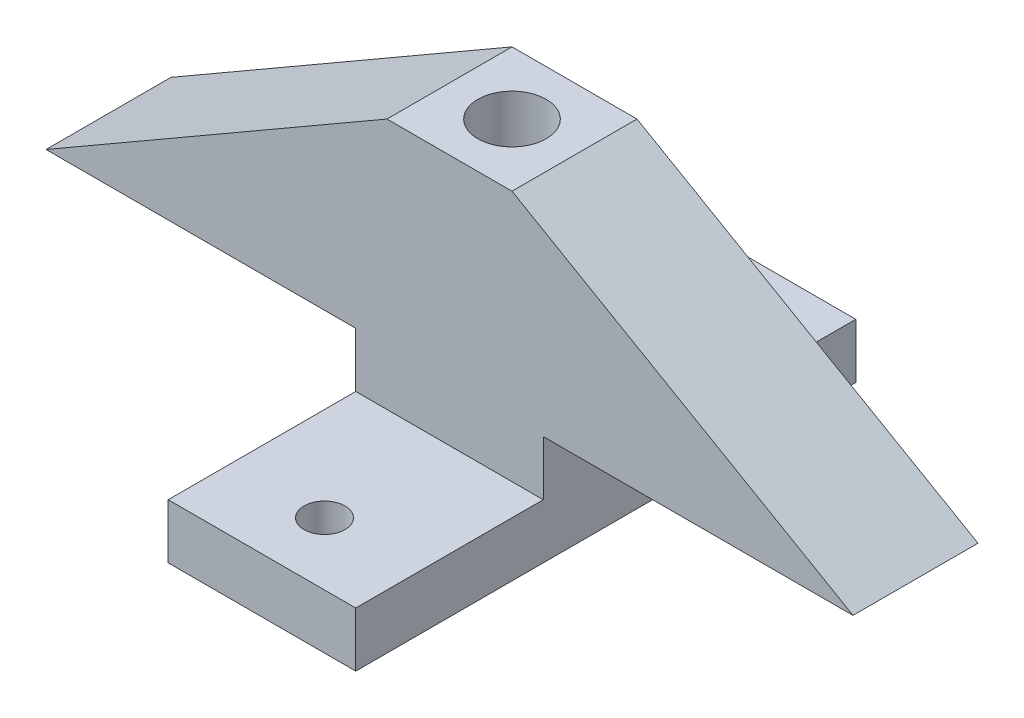
ISO-10303-21;
HEADER;
FILE_DESCRIPTION(('STEP AP214'),'2;1');
FILE_NAME('part.step','',(''),(''),'','','');
FILE_SCHEMA(('AUTOMOTIVE_DESIGN { 1 0 10303 214 1 1 1 1 }'));
ENDSEC;
DATA;
#1=APPLICATION_CONTEXT('core data for automotive mechanical design processes');
#2=APPLICATION_PROTOCOL_DEFINITION('international standard','automotive_design',2000,#1);
#3=PRODUCT_CONTEXT('',#1,'mechanical');
#4=PRODUCT('Part','Part','',(#3));
#5=PRODUCT_RELATED_PRODUCT_CATEGORY('part','',(#4));
#6=PRODUCT_DEFINITION_FORMATION('','',#4);
#7=PRODUCT_DEFINITION_CONTEXT('part definition',#1,'design');
#8=PRODUCT_DEFINITION('design','',#6,#7);
#9=PRODUCT_DEFINITION_SHAPE('','',#8);
#10=(LENGTH_UNIT() NAMED_UNIT(*) SI_UNIT(.MILLI.,.METRE.));
#11=(NAMED_UNIT(*) PLANE_ANGLE_UNIT() SI_UNIT($,.RADIAN.));
#12=(NAMED_UNIT(*) SI_UNIT($,.STERADIAN.) SOLID_ANGLE_UNIT());
#13=UNCERTAINTY_MEASURE_WITH_UNIT(LENGTH_MEASURE(1.E-05),#10,'distance_accuracy_value','');
#14=(GEOMETRIC_REPRESENTATION_CONTEXT(3) GLOBAL_UNCERTAINTY_ASSIGNED_CONTEXT((#13)) GLOBAL_UNIT_ASSIGNED_CONTEXT((#10,
#11,#12)) REPRESENTATION_CONTEXT('',''));
#15=CARTESIAN_POINT('',(0.,0.,0.));
#16=DIRECTION('',(0.,0.,1.));
#17=DIRECTION('',(1.,0.,0.));
#18=AXIS2_PLACEMENT_3D('',#15,#16,#17);
#19=CARTESIAN_POINT('',(0.,0.,25.4));
#20=DIRECTION('',(0.,0.,-1.));
#21=DIRECTION('',(-1.,0.,0.));
#22=AXIS2_PLACEMENT_3D('',#19,#20,#21);
#23=PLANE('',#22);
#24=DIRECTION('',(-1.,0.,0.));
#25=VECTOR('',#24,1.);
#26=CARTESIAN_POINT('',(0.,11.1125,25.4));
#27=LINE('',#26,#25);
#28=CARTESIAN_POINT('',(38.1,11.1125,25.4));
#29=VERTEX_POINT('',#28);
#30=CARTESIAN_POINT('',(0.,11.1125,25.4));
#31=VERTEX_POINT('',#30);
#32=EDGE_CURVE('E57',#29,#31,#27,.T.);
#33=ORIENTED_EDGE('',*,*,#32,.F.);
#34=DIRECTION('',(0.,1.,0.));
#35=VECTOR('',#34,1.);
#36=CARTESIAN_POINT('',(38.1,22.225,25.4));
#37=LINE('',#36,#35);
#38=CARTESIAN_POINT('',(38.1,22.225,25.4));
#39=VERTEX_POINT('',#38);
#40=EDGE_CURVE('E186',#29,#39,#37,.T.);
#41=ORIENTED_EDGE('',*,*,#40,.T.);
#42=DIRECTION('',(1.,0.,0.));
#43=VECTOR('',#42,1.);
#44=CARTESIAN_POINT('',(101.032032302756,22.225,25.4));
#45=LINE('',#44,#43);
#46=CARTESIAN_POINT('',(101.032032302756,22.225,25.4));
#47=VERTEX_POINT('',#46);
#48=EDGE_CURVE('E188',#39,#47,#45,.T.);
#49=ORIENTED_EDGE('',*,*,#48,.T.);
#50=DIRECTION('',(-0.866025403784442,0.499999999999995,0.));
#51=VECTOR('',#50,1.);
#52=CARTESIAN_POINT('',(31.75,62.225,25.4));
#53=LINE('',#52,#51);
#54=CARTESIAN_POINT('',(31.75,62.225,25.4));
#55=VERTEX_POINT('',#54);
#56=EDGE_CURVE('E191',#47,#55,#53,.T.);
#57=ORIENTED_EDGE('',*,*,#56,.T.);
#58=DIRECTION('',(-1.,0.,0.));
#59=VECTOR('',#58,1.);
#60=CARTESIAN_POINT('',(6.35,62.225,25.4));
#61=LINE('',#60,#59);
#62=CARTESIAN_POINT('',(6.35,62.225,25.4));
#63=VERTEX_POINT('',#62);
#64=EDGE_CURVE('E193',#55,#63,#61,.T.);
#65=ORIENTED_EDGE('',*,*,#64,.T.);
#66=DIRECTION('',(-0.866025403784441,-0.499999999999995,0.));
#67=VECTOR('',#66,1.);
#68=CARTESIAN_POINT('',(-62.932032302756,22.225,25.4));
#69=LINE('',#68,#67);
#70=CARTESIAN_POINT('',(-62.932032302756,22.225,25.4));
#71=VERTEX_POINT('',#70);
#72=EDGE_CURVE('E195',#63,#71,#69,.T.);
#73=ORIENTED_EDGE('',*,*,#72,.T.);
#74=DIRECTION('',(1.,0.,0.));
#75=VECTOR('',#74,1.);
#76=CARTESIAN_POINT('',(0.,22.225,25.4));
#77=LINE('',#76,#75);
#78=CARTESIAN_POINT('',(0.,22.225,25.4));
#79=VERTEX_POINT('',#78);
#80=EDGE_CURVE('E197',#71,#79,#77,.T.);
#81=ORIENTED_EDGE('',*,*,#80,.T.);
#82=DIRECTION('',(0.,-1.,0.));
#83=VECTOR('',#82,1.);
#84=CARTESIAN_POINT('',(0.,0.,25.4));
#85=LINE('',#84,#83);
#86=EDGE_CURVE('E199',#79,#31,#85,.T.);
#87=ORIENTED_EDGE('',*,*,#86,.T.);
#88=EDGE_LOOP('',(#33,#41,#49,#57,#65,#73,#81,#87));
#89=FACE_BOUND('',#88,.T.);
#90=ADVANCED_FACE('F34',(#89),#23,.F.);
#91=CARTESIAN_POINT('',(38.1,0.,25.4));
#92=DIRECTION('',(0.,1.,0.));
#93=DIRECTION('',(-1.,0.,0.));
#94=AXIS2_PLACEMENT_3D('',#91,#92,#93);
#95=PLANE('',#94);
#96=CARTESIAN_POINT('',(19.05,0.,-25.4));
#97=DIRECTION('',(0.,1.,0.));
#98=DIRECTION('',(0.,0.,1.));
#99=AXIS2_PLACEMENT_3D('',#96,#97,#98);
#100=CIRCLE('',#99,4.1656);
#101=CARTESIAN_POINT('',(19.05,0.,-21.2344));
#102=VERTEX_POINT('',#101);
#103=EDGE_CURVE('E138',#102,#102,#100,.T.);
#104=ORIENTED_EDGE('',*,*,#103,.T.);
#105=EDGE_LOOP('',(#104));
#106=FACE_BOUND('',#105,.T.);
#107=CARTESIAN_POINT('',(19.05,0.,50.8));
#108=DIRECTION('',(0.,1.,0.));
#109=DIRECTION('',(0.,0.,1.));
#110=AXIS2_PLACEMENT_3D('',#107,#108,#109);
#111=CIRCLE('',#110,4.1656);
#112=CARTESIAN_POINT('',(19.05,0.,54.9656));
#113=VERTEX_POINT('',#112);
#114=EDGE_CURVE('E148',#113,#113,#111,.T.);
#115=ORIENTED_EDGE('',*,*,#114,.T.);
#116=EDGE_LOOP('',(#115));
#117=FACE_BOUND('',#116,.T.);
#118=DIRECTION('',(0.,0.,-1.));
#119=VECTOR('',#118,1.);
#120=CARTESIAN_POINT('',(0.,0.,25.4));
#121=LINE('',#120,#119);
#122=CARTESIAN_POINT('',(0.,0.,63.5));
#123=VERTEX_POINT('',#122);
#124=CARTESIAN_POINT('',(0.,0.,-38.1));
#125=VERTEX_POINT('',#124);
#126=EDGE_CURVE('E201',#123,#125,#121,.T.);
#127=ORIENTED_EDGE('',*,*,#126,.T.);
#128=DIRECTION('',(-1.,0.,0.));
#129=VECTOR('',#128,1.);
#130=CARTESIAN_POINT('',(38.1,0.,-38.1));
#131=LINE('',#130,#129);
#132=CARTESIAN_POINT('',(38.1,0.,-38.1));
#133=VERTEX_POINT('',#132);
#134=EDGE_CURVE('E154',#133,#125,#131,.T.);
#135=ORIENTED_EDGE('',*,*,#134,.F.);
#136=DIRECTION('',(0.,0.,-1.));
#137=VECTOR('',#136,1.);
#138=CARTESIAN_POINT('',(38.1,0.,25.4));
#139=LINE('',#138,#137);
#140=CARTESIAN_POINT('',(38.1,0.,63.5));
#141=VERTEX_POINT('',#140);
#142=EDGE_CURVE('E11',#141,#133,#139,.T.);
#143=ORIENTED_EDGE('',*,*,#142,.F.);
#144=DIRECTION('',(1.,0.,0.));
#145=VECTOR('',#144,1.);
#146=CARTESIAN_POINT('',(0.,0.,63.5));
#147=LINE('',#146,#145);
#148=EDGE_CURVE('E171',#123,#141,#147,.T.);
#149=ORIENTED_EDGE('',*,*,#148,.F.);
#150=EDGE_LOOP('',(#127,#135,#143,#149));
#151=FACE_BOUND('',#150,.T.);
#152=ADVANCED_FACE('F36',(#106,#117,#151),#95,.F.);
#153=CARTESIAN_POINT('',(38.1,22.225,25.4));
#154=DIRECTION('',(-1.,0.,0.));
#155=DIRECTION('',(0.,0.,1.));
#156=AXIS2_PLACEMENT_3D('',#153,#154,#155);
#157=PLANE('',#156);
#158=ORIENTED_EDGE('',*,*,#142,.T.);
#159=DIRECTION('',(0.,-1.,0.));
#160=VECTOR('',#159,1.);
#161=CARTESIAN_POINT('',(38.1,0.,-38.1));
#162=LINE('',#161,#160);
#163=CARTESIAN_POINT('',(38.1,11.1125,-38.1));
#164=VERTEX_POINT('',#163);
#165=EDGE_CURVE('E151',#164,#133,#162,.T.);
#166=ORIENTED_EDGE('',*,*,#165,.F.);
#167=DIRECTION('',(0.,0.,1.));
#168=VECTOR('',#167,1.);
#169=CARTESIAN_POINT('',(38.1,11.1125,-38.1));
#170=LINE('',#169,#168);
#171=CARTESIAN_POINT('',(38.1,11.1125,0.));
#172=VERTEX_POINT('',#171);
#173=EDGE_CURVE('E161',#164,#172,#170,.T.);
#174=ORIENTED_EDGE('',*,*,#173,.T.);
#175=DIRECTION('',(0.,1.,0.));
#176=VECTOR('',#175,1.);
#177=CARTESIAN_POINT('',(38.1,22.225,0.));
#178=LINE('',#177,#176);
#179=CARTESIAN_POINT('',(38.1,22.225,0.));
#180=VERTEX_POINT('',#179);
#181=EDGE_CURVE('E185',#172,#180,#178,.T.);
#182=ORIENTED_EDGE('',*,*,#181,.T.);
#183=DIRECTION('',(0.,0.,-1.));
#184=VECTOR('',#183,1.);
#185=CARTESIAN_POINT('',(38.1,22.225,25.4));
#186=LINE('',#185,#184);
#187=EDGE_CURVE('E42',#39,#180,#186,.T.);
#188=ORIENTED_EDGE('',*,*,#187,.F.);
#189=ORIENTED_EDGE('',*,*,#40,.F.);
#190=DIRECTION('',(0.,0.,-1.));
#191=VECTOR('',#190,1.);
#192=CARTESIAN_POINT('',(38.1,11.1125,63.5));
#193=LINE('',#192,#191);
#194=CARTESIAN_POINT('',(38.1,11.1125,63.5));
#195=VERTEX_POINT('',#194);
#196=EDGE_CURVE('E182',#195,#29,#193,.T.);
#197=ORIENTED_EDGE('',*,*,#196,.F.);
#198=DIRECTION('',(0.,1.,0.));
#199=VECTOR('',#198,1.);
#200=CARTESIAN_POINT('',(38.1,0.,63.5));
#201=LINE('',#200,#199);
#202=EDGE_CURVE('E174',#141,#195,#201,.T.);
#203=ORIENTED_EDGE('',*,*,#202,.F.);
#204=EDGE_LOOP('',(#158,#166,#174,#182,#188,#189,#197,#203));
#205=FACE_BOUND('',#204,.T.);
#206=ADVANCED_FACE('F252',(#205),#157,.F.);
#207=CARTESIAN_POINT('',(101.032032302756,22.225,25.4));
#208=DIRECTION('',(0.,1.,0.));
#209=DIRECTION('',(-1.,0.,0.));
#210=AXIS2_PLACEMENT_3D('',#207,#208,#209);
#211=PLANE('',#210);
#212=DIRECTION('',(1.,0.,0.));
#213=VECTOR('',#212,1.);
#214=CARTESIAN_POINT('',(101.032032302756,22.225,0.));
#215=LINE('',#214,#213);
#216=CARTESIAN_POINT('',(101.032032302756,22.225,0.));
#217=VERTEX_POINT('',#216);
#218=EDGE_CURVE('E203',#180,#217,#215,.T.);
#219=ORIENTED_EDGE('',*,*,#218,.T.);
#220=DIRECTION('',(0.,0.,-1.));
#221=VECTOR('',#220,1.);
#222=CARTESIAN_POINT('',(101.032032302756,22.225,25.4));
#223=LINE('',#222,#221);
#224=EDGE_CURVE('E227',#47,#217,#223,.T.);
#225=ORIENTED_EDGE('',*,*,#224,.F.);
#226=ORIENTED_EDGE('',*,*,#48,.F.);
#227=ORIENTED_EDGE('',*,*,#187,.T.);
#228=EDGE_LOOP('',(#219,#225,#226,#227));
#229=FACE_BOUND('',#228,.T.);
#230=ADVANCED_FACE('F234',(#229),#211,.F.);
#231=CARTESIAN_POINT('',(31.75,62.225,25.4));
#232=DIRECTION('',(-0.499999999999995,-0.866025403784442,0.));
#233=DIRECTION('',(0.866025403784442,-0.499999999999995,0.));
#234=AXIS2_PLACEMENT_3D('',#231,#232,#233);
#235=PLANE('',#234);
#236=DIRECTION('',(-0.866025403784442,0.499999999999995,0.));
#237=VECTOR('',#236,1.);
#238=CARTESIAN_POINT('',(31.75,62.225,0.));
#239=LINE('',#238,#237);
#240=CARTESIAN_POINT('',(31.75,62.225,0.));
#241=VERTEX_POINT('',#240);
#242=EDGE_CURVE('E205',#217,#241,#239,.T.);
#243=ORIENTED_EDGE('',*,*,#242,.T.);
#244=DIRECTION('',(0.,0.,-1.));
#245=VECTOR('',#244,1.);
#246=CARTESIAN_POINT('',(31.75,62.225,25.4));
#247=LINE('',#246,#245);
#248=EDGE_CURVE('E224',#55,#241,#247,.T.);
#249=ORIENTED_EDGE('',*,*,#248,.F.);
#250=ORIENTED_EDGE('',*,*,#56,.F.);
#251=ORIENTED_EDGE('',*,*,#224,.T.);
#252=EDGE_LOOP('',(#243,#249,#250,#251));
#253=FACE_BOUND('',#252,.T.);
#254=ADVANCED_FACE('F243',(#253),#235,.F.);
#255=CARTESIAN_POINT('',(6.35,62.225,25.4));
#256=DIRECTION('',(0.,-1.,0.));
#257=DIRECTION('',(0.,0.,-1.));
#258=AXIS2_PLACEMENT_3D('',#255,#256,#257);
#259=PLANE('',#258);
#260=CARTESIAN_POINT('',(19.05,62.225,12.7));
#261=DIRECTION('',(0.,1.,0.));
#262=DIRECTION('',(0.,0.,1.));
#263=AXIS2_PLACEMENT_3D('',#260,#261,#262);
#264=CIRCLE('',#263,6.94689999999999);
#265=CARTESIAN_POINT('',(19.05,62.225,19.6469));
#266=VERTEX_POINT('',#265);
#267=EDGE_CURVE('E135',#266,#266,#264,.T.);
#268=ORIENTED_EDGE('',*,*,#267,.F.);
#269=EDGE_LOOP('',(#268));
#270=FACE_BOUND('',#269,.T.);
#271=DIRECTION('',(-1.,0.,0.));
#272=VECTOR('',#271,1.);
#273=CARTESIAN_POINT('',(6.35,62.225,0.));
#274=LINE('',#273,#272);
#275=CARTESIAN_POINT('',(6.35,62.225,0.));
#276=VERTEX_POINT('',#275);
#277=EDGE_CURVE('E207',#241,#276,#274,.T.);
#278=ORIENTED_EDGE('',*,*,#277,.T.);
#279=DIRECTION('',(0.,0.,-1.));
#280=VECTOR('',#279,1.);
#281=CARTESIAN_POINT('',(6.35,62.225,25.4));
#282=LINE('',#281,#280);
#283=EDGE_CURVE('E221',#63,#276,#282,.T.);
#284=ORIENTED_EDGE('',*,*,#283,.F.);
#285=ORIENTED_EDGE('',*,*,#64,.F.);
#286=ORIENTED_EDGE('',*,*,#248,.T.);
#287=EDGE_LOOP('',(#278,#284,#285,#286));
#288=FACE_BOUND('',#287,.T.);
#289=ADVANCED_FACE('F247',(#270,#288),#259,.F.);
#290=CARTESIAN_POINT('',(-62.932032302756,22.225,25.4));
#291=DIRECTION('',(0.499999999999995,-0.866025403784441,0.));
#292=DIRECTION('',(0.866025403784441,0.499999999999995,0.));
#293=AXIS2_PLACEMENT_3D('',#290,#291,#292);
#294=PLANE('',#293);
#295=DIRECTION('',(-0.866025403784441,-0.499999999999995,0.));
#296=VECTOR('',#295,1.);
#297=CARTESIAN_POINT('',(-62.932032302756,22.225,0.));
#298=LINE('',#297,#296);
#299=CARTESIAN_POINT('',(-62.932032302756,22.225,0.));
#300=VERTEX_POINT('',#299);
#301=EDGE_CURVE('E209',#276,#300,#298,.T.);
#302=ORIENTED_EDGE('',*,*,#301,.T.);
#303=DIRECTION('',(0.,0.,-1.));
#304=VECTOR('',#303,1.);
#305=CARTESIAN_POINT('',(-62.932032302756,22.225,25.4));
#306=LINE('',#305,#304);
#307=EDGE_CURVE('E218',#71,#300,#306,.T.);
#308=ORIENTED_EDGE('',*,*,#307,.F.);
#309=ORIENTED_EDGE('',*,*,#72,.F.);
#310=ORIENTED_EDGE('',*,*,#283,.T.);
#311=EDGE_LOOP('',(#302,#308,#309,#310));
#312=FACE_BOUND('',#311,.T.);
#313=ADVANCED_FACE('F282',(#312),#294,.F.);
#314=CARTESIAN_POINT('',(0.,22.225,25.4));
#315=DIRECTION('',(0.,1.,0.));
#316=DIRECTION('',(-1.,0.,0.));
#317=AXIS2_PLACEMENT_3D('',#314,#315,#316);
#318=PLANE('',#317);
#319=DIRECTION('',(1.,0.,0.));
#320=VECTOR('',#319,1.);
#321=CARTESIAN_POINT('',(0.,22.225,0.));
#322=LINE('',#321,#320);
#323=CARTESIAN_POINT('',(0.,22.225,0.));
#324=VERTEX_POINT('',#323);
#325=EDGE_CURVE('E211',#300,#324,#322,.T.);
#326=ORIENTED_EDGE('',*,*,#325,.T.);
#327=DIRECTION('',(0.,0.,-1.));
#328=VECTOR('',#327,1.);
#329=CARTESIAN_POINT('',(0.,22.225,25.4));
#330=LINE('',#329,#328);
#331=EDGE_CURVE('E215',#79,#324,#330,.T.);
#332=ORIENTED_EDGE('',*,*,#331,.F.);
#333=ORIENTED_EDGE('',*,*,#80,.F.);
#334=ORIENTED_EDGE('',*,*,#307,.T.);
#335=EDGE_LOOP('',(#326,#332,#333,#334));
#336=FACE_BOUND('',#335,.T.);
#337=ADVANCED_FACE('F279',(#336),#318,.F.);
#338=CARTESIAN_POINT('',(0.,0.,25.4));
#339=DIRECTION('',(1.,0.,0.));
#340=DIRECTION('',(0.,0.,-1.));
#341=AXIS2_PLACEMENT_3D('',#338,#339,#340);
#342=PLANE('',#341);
#343=DIRECTION('',(0.,-1.,0.));
#344=VECTOR('',#343,1.);
#345=CARTESIAN_POINT('',(0.,0.,0.));
#346=LINE('',#345,#344);
#347=CARTESIAN_POINT('',(0.,11.1125,0.));
#348=VERTEX_POINT('',#347);
#349=EDGE_CURVE('E189',#324,#348,#346,.T.);
#350=ORIENTED_EDGE('',*,*,#349,.T.);
#351=DIRECTION('',(0.,0.,1.));
#352=VECTOR('',#351,1.);
#353=CARTESIAN_POINT('',(0.,11.1125,-38.1));
#354=LINE('',#353,#352);
#355=CARTESIAN_POINT('',(0.,11.1125,-38.1));
#356=VERTEX_POINT('',#355);
#357=EDGE_CURVE('E165',#356,#348,#354,.T.);
#358=ORIENTED_EDGE('',*,*,#357,.F.);
#359=DIRECTION('',(0.,1.,0.));
#360=VECTOR('',#359,1.);
#361=CARTESIAN_POINT('',(0.,0.,-38.1));
#362=LINE('',#361,#360);
#363=EDGE_CURVE('E157',#125,#356,#362,.T.);
#364=ORIENTED_EDGE('',*,*,#363,.F.);
#365=ORIENTED_EDGE('',*,*,#126,.F.);
#366=DIRECTION('',(0.,-1.,0.));
#367=VECTOR('',#366,1.);
#368=CARTESIAN_POINT('',(0.,0.,63.5));
#369=LINE('',#368,#367);
#370=CARTESIAN_POINT('',(0.,11.1125,63.5));
#371=VERTEX_POINT('',#370);
#372=EDGE_CURVE('E168',#371,#123,#369,.T.);
#373=ORIENTED_EDGE('',*,*,#372,.F.);
#374=DIRECTION('',(0.,0.,-1.));
#375=VECTOR('',#374,1.);
#376=CARTESIAN_POINT('',(0.,11.1125,63.5));
#377=LINE('',#376,#375);
#378=EDGE_CURVE('E178',#371,#31,#377,.T.);
#379=ORIENTED_EDGE('',*,*,#378,.T.);
#380=ORIENTED_EDGE('',*,*,#86,.F.);
#381=ORIENTED_EDGE('',*,*,#331,.T.);
#382=EDGE_LOOP('',(#350,#358,#364,#365,#373,#379,#380,#381));
#383=FACE_BOUND('',#382,.T.);
#384=ADVANCED_FACE('F274',(#383),#342,.F.);
#385=CARTESIAN_POINT('',(0.,0.,0.));
#386=DIRECTION('',(0.,0.,-1.));
#387=DIRECTION('',(-1.,0.,0.));
#388=AXIS2_PLACEMENT_3D('',#385,#386,#387);
#389=PLANE('',#388);
#390=DIRECTION('',(1.,0.,0.));
#391=VECTOR('',#390,1.);
#392=CARTESIAN_POINT('',(38.1,11.1125,0.));
#393=LINE('',#392,#391);
#394=EDGE_CURVE('E49',#348,#172,#393,.T.);
#395=ORIENTED_EDGE('',*,*,#394,.F.);
#396=ORIENTED_EDGE('',*,*,#349,.F.);
#397=ORIENTED_EDGE('',*,*,#325,.F.);
#398=ORIENTED_EDGE('',*,*,#301,.F.);
#399=ORIENTED_EDGE('',*,*,#277,.F.);
#400=ORIENTED_EDGE('',*,*,#242,.F.);
#401=ORIENTED_EDGE('',*,*,#218,.F.);
#402=ORIENTED_EDGE('',*,*,#181,.F.);
#403=EDGE_LOOP('',(#395,#396,#397,#398,#399,#400,#401,#402));
#404=FACE_BOUND('',#403,.T.);
#405=ADVANCED_FACE('F238',(#404),#389,.T.);
#406=CARTESIAN_POINT('',(0.,11.1125,63.5));
#407=DIRECTION('',(0.,-1.,0.));
#408=DIRECTION('',(0.,0.,-1.));
#409=AXIS2_PLACEMENT_3D('',#406,#407,#408);
#410=PLANE('',#409);
#411=CARTESIAN_POINT('',(19.05,11.1125,50.8));
#412=DIRECTION('',(0.,1.,0.));
#413=DIRECTION('',(0.,0.,1.));
#414=AXIS2_PLACEMENT_3D('',#411,#412,#413);
#415=CIRCLE('',#414,4.1656);
#416=CARTESIAN_POINT('',(19.05,11.1125,54.9656));
#417=VERTEX_POINT('',#416);
#418=EDGE_CURVE('E145',#417,#417,#415,.T.);
#419=ORIENTED_EDGE('',*,*,#418,.F.);
#420=EDGE_LOOP('',(#419));
#421=FACE_BOUND('',#420,.T.);
#422=ORIENTED_EDGE('',*,*,#32,.T.);
#423=ORIENTED_EDGE('',*,*,#378,.F.);
#424=DIRECTION('',(-1.,0.,0.));
#425=VECTOR('',#424,1.);
#426=CARTESIAN_POINT('',(0.,11.1125,63.5));
#427=LINE('',#426,#425);
#428=EDGE_CURVE('E176',#195,#371,#427,.T.);
#429=ORIENTED_EDGE('',*,*,#428,.F.);
#430=ORIENTED_EDGE('',*,*,#196,.T.);
#431=EDGE_LOOP('',(#422,#423,#429,#430));
#432=FACE_BOUND('',#431,.T.);
#433=ADVANCED_FACE('F256',(#421,#432),#410,.F.);
#434=CARTESIAN_POINT('',(0.,0.,63.5));
#435=DIRECTION('',(0.,0.,-1.));
#436=DIRECTION('',(-1.,0.,0.));
#437=AXIS2_PLACEMENT_3D('',#434,#435,#436);
#438=PLANE('',#437);
#439=ORIENTED_EDGE('',*,*,#372,.T.);
#440=ORIENTED_EDGE('',*,*,#148,.T.);
#441=ORIENTED_EDGE('',*,*,#202,.T.);
#442=ORIENTED_EDGE('',*,*,#428,.T.);
#443=EDGE_LOOP('',(#439,#440,#441,#442));
#444=FACE_BOUND('',#443,.T.);
#445=ADVANCED_FACE('F260',(#444),#438,.F.);
#446=CARTESIAN_POINT('',(38.1,11.1125,-38.1));
#447=DIRECTION('',(0.,-1.,0.));
#448=DIRECTION('',(0.,0.,-1.));
#449=AXIS2_PLACEMENT_3D('',#446,#447,#448);
#450=PLANE('',#449);
#451=CARTESIAN_POINT('',(19.05,11.1125,-25.4));
#452=DIRECTION('',(0.,1.,0.));
#453=DIRECTION('',(0.,0.,1.));
#454=AXIS2_PLACEMENT_3D('',#451,#452,#453);
#455=CIRCLE('',#454,4.1656);
#456=CARTESIAN_POINT('',(19.05,11.1125,-21.2344));
#457=VERTEX_POINT('',#456);
#458=EDGE_CURVE('E134',#457,#457,#455,.T.);
#459=ORIENTED_EDGE('',*,*,#458,.F.);
#460=EDGE_LOOP('',(#459));
#461=FACE_BOUND('',#460,.T.);
#462=ORIENTED_EDGE('',*,*,#394,.T.);
#463=ORIENTED_EDGE('',*,*,#173,.F.);
#464=DIRECTION('',(1.,0.,0.));
#465=VECTOR('',#464,1.);
#466=CARTESIAN_POINT('',(38.1,11.1125,-38.1));
#467=LINE('',#466,#465);
#468=EDGE_CURVE('E159',#356,#164,#467,.T.);
#469=ORIENTED_EDGE('',*,*,#468,.F.);
#470=ORIENTED_EDGE('',*,*,#357,.T.);
#471=EDGE_LOOP('',(#462,#463,#469,#470));
#472=FACE_BOUND('',#471,.T.);
#473=ADVANCED_FACE('F272',(#461,#472),#450,.F.);
#474=CARTESIAN_POINT('',(0.,0.,-38.1));
#475=DIRECTION('',(0.,0.,1.));
#476=DIRECTION('',(1.,0.,0.));
#477=AXIS2_PLACEMENT_3D('',#474,#475,#476);
#478=PLANE('',#477);
#479=ORIENTED_EDGE('',*,*,#165,.T.);
#480=ORIENTED_EDGE('',*,*,#134,.T.);
#481=ORIENTED_EDGE('',*,*,#363,.T.);
#482=ORIENTED_EDGE('',*,*,#468,.T.);
#483=EDGE_LOOP('',(#479,#480,#481,#482));
#484=FACE_BOUND('',#483,.T.);
#485=ADVANCED_FACE('F267',(#484),#478,.F.);
#486=CARTESIAN_POINT('',(19.05,11.1125,50.8));
#487=DIRECTION('',(0.,1.,0.));
#488=DIRECTION('',(0.,0.,1.));
#489=AXIS2_PLACEMENT_3D('',#486,#487,#488);
#490=CYLINDRICAL_SURFACE('',#489,4.1656);
#491=ORIENTED_EDGE('',*,*,#114,.F.);
#492=EDGE_LOOP('',(#491));
#493=FACE_BOUND('',#492,.T.);
#494=ORIENTED_EDGE('',*,*,#418,.T.);
#495=EDGE_LOOP('',(#494));
#496=FACE_BOUND('',#495,.T.);
#497=ADVANCED_FACE('F339',(#493,#496),#490,.F.);
#498=CARTESIAN_POINT('',(19.05,11.1125,-25.4));
#499=DIRECTION('',(0.,1.,0.));
#500=DIRECTION('',(0.,0.,1.));
#501=AXIS2_PLACEMENT_3D('',#498,#499,#500);
#502=CYLINDRICAL_SURFACE('',#501,4.1656);
#503=ORIENTED_EDGE('',*,*,#103,.F.);
#504=EDGE_LOOP('',(#503));
#505=FACE_BOUND('',#504,.T.);
#506=ORIENTED_EDGE('',*,*,#458,.T.);
#507=EDGE_LOOP('',(#506));
#508=FACE_BOUND('',#507,.T.);
#509=ADVANCED_FACE('F128',(#505,#508),#502,.F.);
#510=CARTESIAN_POINT('',(19.05,27.173,12.7));
#511=DIRECTION('',(0.,1.,0.));
#512=DIRECTION('',(0.,0.,1.));
#513=AXIS2_PLACEMENT_3D('',#510,#511,#512);
#514=CONICAL_SURFACE('',#513,6.94689999999999,1.02974425867665);
#515=CARTESIAN_POINT('',(19.05,22.9988813656774,12.7));
#516=VERTEX_POINT('',#515);
#517=VERTEX_LOOP('',#516);
#518=FACE_BOUND('',#517,.T.);
#519=CARTESIAN_POINT('',(19.05,27.173,12.7));
#520=DIRECTION('',(0.,1.,0.));
#521=DIRECTION('',(0.,0.,1.));
#522=AXIS2_PLACEMENT_3D('',#519,#520,#521);
#523=CIRCLE('',#522,6.94689999999999);
#524=CARTESIAN_POINT('',(19.05,27.173,19.6469));
#525=VERTEX_POINT('',#524);
#526=EDGE_CURVE('E132',#525,#525,#523,.T.);
#527=ORIENTED_EDGE('',*,*,#526,.T.);
#528=EDGE_LOOP('',(#527));
#529=FACE_BOUND('',#528,.T.);
#530=ADVANCED_FACE('F124',(#518,#529),#514,.F.);
#531=CARTESIAN_POINT('',(19.05,62.225,12.7));
#532=DIRECTION('',(0.,1.,0.));
#533=DIRECTION('',(0.,0.,1.));
#534=AXIS2_PLACEMENT_3D('',#531,#532,#533);
#535=CYLINDRICAL_SURFACE('',#534,6.94689999999999);
#536=ORIENTED_EDGE('',*,*,#526,.F.);
#537=EDGE_LOOP('',(#536));
#538=FACE_BOUND('',#537,.T.);
#539=ORIENTED_EDGE('',*,*,#267,.T.);
#540=EDGE_LOOP('',(#539));
#541=FACE_BOUND('',#540,.T.);
#542=ADVANCED_FACE('F127',(#538,#541),#535,.F.);
#543=CLOSED_SHELL('',(#90,#152,#206,#230,#254,#289,#313,#337,#384,#405,#433,#445,#473,#485,#497,
#509,#530,#542));
#544=MANIFOLD_SOLID_BREP('B2',#543);
#545=ADVANCED_BREP_SHAPE_REPRESENTATION('',(#18,#544),#14);
#546=SHAPE_DEFINITION_REPRESENTATION(#9,#545);
ENDSEC;
END-ISO-10303-21;
